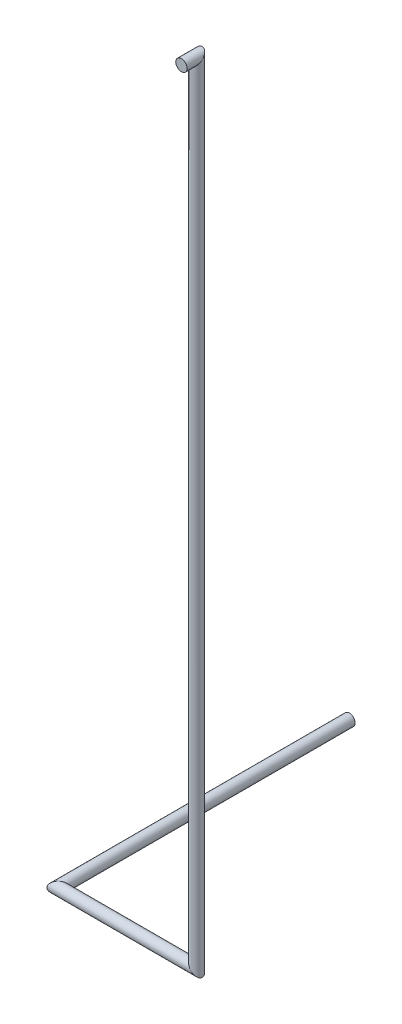
ISO-10303-21;
HEADER;
FILE_DESCRIPTION(('STEP AP214'),'2;1');
FILE_NAME('part.step','',(''),(''),'','','');
FILE_SCHEMA(('AUTOMOTIVE_DESIGN { 1 0 10303 214 1 1 1 1 }'));
ENDSEC;
DATA;
#1=APPLICATION_CONTEXT('core data for automotive mechanical design processes');
#2=APPLICATION_PROTOCOL_DEFINITION('international standard','automotive_design',2000,#1);
#3=PRODUCT_CONTEXT('',#1,'mechanical');
#4=PRODUCT('Part','Part','',(#3));
#5=PRODUCT_RELATED_PRODUCT_CATEGORY('part','',(#4));
#6=PRODUCT_DEFINITION_FORMATION('','',#4);
#7=PRODUCT_DEFINITION_CONTEXT('part definition',#1,'design');
#8=PRODUCT_DEFINITION('design','',#6,#7);
#9=PRODUCT_DEFINITION_SHAPE('','',#8);
#10=(LENGTH_UNIT() NAMED_UNIT(*) SI_UNIT(.MILLI.,.METRE.));
#11=(NAMED_UNIT(*) PLANE_ANGLE_UNIT() SI_UNIT($,.RADIAN.));
#12=(NAMED_UNIT(*) SI_UNIT($,.STERADIAN.) SOLID_ANGLE_UNIT());
#13=UNCERTAINTY_MEASURE_WITH_UNIT(LENGTH_MEASURE(1.E-05),#10,'distance_accuracy_value','');
#14=(GEOMETRIC_REPRESENTATION_CONTEXT(3) GLOBAL_UNCERTAINTY_ASSIGNED_CONTEXT((#13)) GLOBAL_UNIT_ASSIGNED_CONTEXT((#10,
#11,#12)) REPRESENTATION_CONTEXT('',''));
#15=CARTESIAN_POINT('',(0.,0.,0.));
#16=DIRECTION('',(0.,0.,1.));
#17=DIRECTION('',(1.,0.,0.));
#18=AXIS2_PLACEMENT_3D('',#15,#16,#17);
#19=CARTESIAN_POINT('',(-182.,-1038.,-403.));
#20=DIRECTION('',(0.,0.,1.));
#21=DIRECTION('',(0.,-1.,0.));
#22=AXIS2_PLACEMENT_3D('',#19,#20,#21);
#23=PLANE('',#22);
#24=CARTESIAN_POINT('',(-182.,-1038.,-403.));
#25=DIRECTION('',(0.,0.,1.));
#26=DIRECTION('',(0.,-1.,0.));
#27=AXIS2_PLACEMENT_3D('',#24,#25,#26);
#28=CIRCLE('',#27,7.5);
#29=CARTESIAN_POINT('',(-182.,-1045.5,-403.));
#30=VERTEX_POINT('',#29);
#31=EDGE_CURVE('E42',#30,#30,#28,.T.);
#32=ORIENTED_EDGE('',*,*,#31,.F.);
#33=EDGE_LOOP('',(#32));
#34=FACE_BOUND('',#33,.T.);
#35=ADVANCED_FACE('F39',(#34),#23,.F.);
#36=CARTESIAN_POINT('',(0.,0.,0.));
#37=DIRECTION('',(0.,0.,1.));
#38=DIRECTION('',(1.,0.,0.));
#39=AXIS2_PLACEMENT_3D('',#36,#37,#38);
#40=PLANE('',#39);
#41=CARTESIAN_POINT('',(0.,0.,0.));
#42=DIRECTION('',(0.,0.,1.));
#43=DIRECTION('',(1.,0.,0.));
#44=AXIS2_PLACEMENT_3D('',#41,#42,#43);
#45=CIRCLE('',#44,7.5);
#46=CARTESIAN_POINT('',(7.5,0.,0.));
#47=VERTEX_POINT('',#46);
#48=EDGE_CURVE('E46',#47,#47,#45,.T.);
#49=ORIENTED_EDGE('',*,*,#48,.T.);
#50=EDGE_LOOP('',(#49));
#51=FACE_BOUND('',#50,.T.);
#52=ADVANCED_FACE('F65',(#51),#40,.T.);
#53=CARTESIAN_POINT('',(-182.,-1038.,-3.4));
#54=DIRECTION('',(0.,0.,-1.));
#55=DIRECTION('',(-1.,0.,0.));
#56=AXIS2_PLACEMENT_3D('',#53,#54,#55);
#57=CYLINDRICAL_SURFACE('',#56,7.5);
#58=CARTESIAN_POINT('',(-182.,-1038.,-20.));
#59=DIRECTION('',(-0.707106781186547,0.,-0.707106781186548));
#60=DIRECTION('',(-0.707106781186548,0.,0.707106781186547));
#61=AXIS2_PLACEMENT_3D('',#58,#59,#60);
#62=ELLIPSE('',#61,10.6066017177982,7.5);
#63=CARTESIAN_POINT('',(-189.5,-1038.,-12.5));
#64=VERTEX_POINT('',#63);
#65=EDGE_CURVE('E55',#64,#64,#62,.T.);
#66=ORIENTED_EDGE('',*,*,#65,.T.);
#67=EDGE_LOOP('',(#66));
#68=FACE_BOUND('',#67,.T.);
#69=ORIENTED_EDGE('',*,*,#31,.T.);
#70=EDGE_LOOP('',(#69));
#71=FACE_BOUND('',#70,.T.);
#72=ADVANCED_FACE('F62',(#68,#71),#57,.T.);
#73=CARTESIAN_POINT('',(8.34999999999995,-1038.,-20.));
#74=DIRECTION('',(-1.,0.,0.));
#75=DIRECTION('',(0.,0.,1.));
#76=AXIS2_PLACEMENT_3D('',#73,#74,#75);
#77=CYLINDRICAL_SURFACE('',#76,7.5);
#78=CARTESIAN_POINT('',(-1.27118337750892E-13,-1038.,-20.));
#79=DIRECTION('',(-0.707106781186548,-0.707106781186547,0.));
#80=DIRECTION('',(0.707106781186547,-0.707106781186548,0.));
#81=AXIS2_PLACEMENT_3D('',#78,#79,#80);
#82=ELLIPSE('',#81,10.6066017177982,7.5);
#83=CARTESIAN_POINT('',(7.49999999999987,-1045.5,-20.));
#84=VERTEX_POINT('',#83);
#85=EDGE_CURVE('E51',#84,#84,#82,.T.);
#86=ORIENTED_EDGE('',*,*,#85,.T.);
#87=EDGE_LOOP('',(#86));
#88=FACE_BOUND('',#87,.T.);
#89=ORIENTED_EDGE('',*,*,#65,.F.);
#90=EDGE_LOOP('',(#89));
#91=FACE_BOUND('',#90,.T.);
#92=ADVANCED_FACE('F78',(#88,#91),#77,.T.);
#93=CARTESIAN_POINT('',(0.,16.6,-20.));
#94=DIRECTION('',(0.,-1.,0.));
#95=DIRECTION('',(1.,0.,0.));
#96=AXIS2_PLACEMENT_3D('',#93,#94,#95);
#97=CYLINDRICAL_SURFACE('',#96,7.5);
#98=CARTESIAN_POINT('',(0.,0.,-20.));
#99=DIRECTION('',(0.,-0.707106781186547,-0.707106781186547));
#100=DIRECTION('',(0.,0.707106781186548,-0.707106781186548));
#101=AXIS2_PLACEMENT_3D('',#98,#99,#100);
#102=ELLIPSE('',#101,10.6066017177982,7.5);
#103=CARTESIAN_POINT('',(0.,7.5,-27.5));
#104=VERTEX_POINT('',#103);
#105=EDGE_CURVE('E10',#104,#104,#102,.T.);
#106=ORIENTED_EDGE('',*,*,#105,.T.);
#107=EDGE_LOOP('',(#106));
#108=FACE_BOUND('',#107,.T.);
#109=ORIENTED_EDGE('',*,*,#85,.F.);
#110=EDGE_LOOP('',(#109));
#111=FACE_BOUND('',#110,.T.);
#112=ADVANCED_FACE('F72',(#108,#111),#97,.T.);
#113=CARTESIAN_POINT('',(0.,0.,0.));
#114=DIRECTION('',(0.,0.,-1.));
#115=DIRECTION('',(-1.,0.,0.));
#116=AXIS2_PLACEMENT_3D('',#113,#114,#115);
#117=CYLINDRICAL_SURFACE('',#116,7.5);
#118=ORIENTED_EDGE('',*,*,#48,.F.);
#119=EDGE_LOOP('',(#118));
#120=FACE_BOUND('',#119,.T.);
#121=ORIENTED_EDGE('',*,*,#105,.F.);
#122=EDGE_LOOP('',(#121));
#123=FACE_BOUND('',#122,.T.);
#124=ADVANCED_FACE('F70',(#120,#123),#117,.T.);
#125=CLOSED_SHELL('',(#35,#52,#72,#92,#112,#124));
#126=MANIFOLD_SOLID_BREP('B2',#125);
#127=ADVANCED_BREP_SHAPE_REPRESENTATION('',(#18,#126),#14);
#128=SHAPE_DEFINITION_REPRESENTATION(#9,#127);
ENDSEC;
END-ISO-10303-21;
